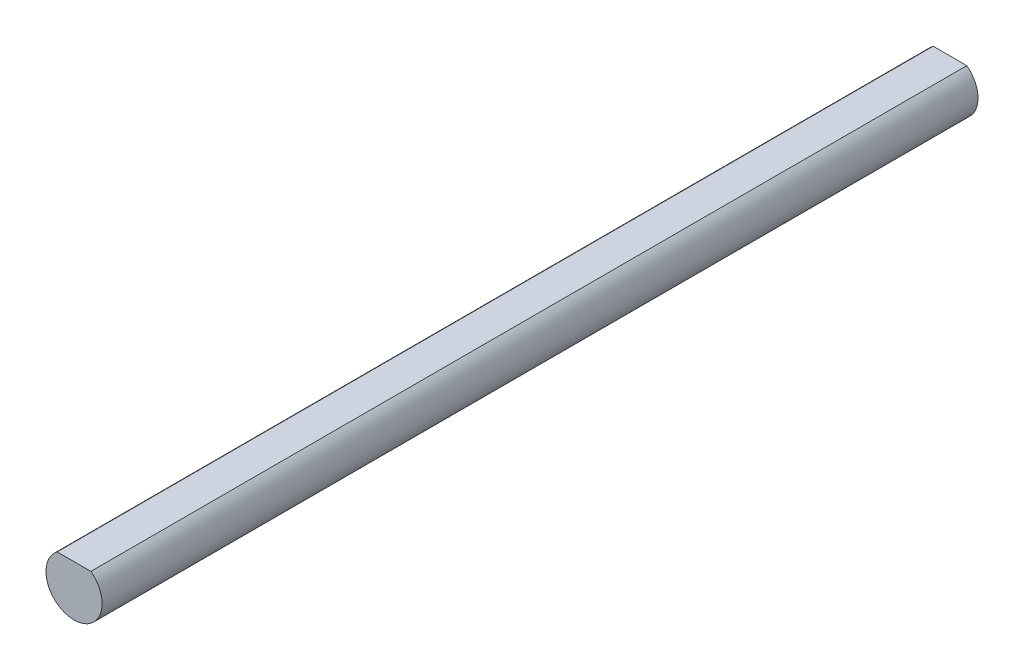
ISO-10303-21;
HEADER;
FILE_DESCRIPTION(('STEP AP214'),'2;1');
FILE_NAME('part.step','',(''),(''),'','','');
FILE_SCHEMA(('AUTOMOTIVE_DESIGN { 1 0 10303 214 1 1 1 1 }'));
ENDSEC;
DATA;
#1=APPLICATION_CONTEXT('core data for automotive mechanical design processes');
#2=APPLICATION_PROTOCOL_DEFINITION('international standard','automotive_design',2000,#1);
#3=PRODUCT_CONTEXT('',#1,'mechanical');
#4=PRODUCT('Part','Part','',(#3));
#5=PRODUCT_RELATED_PRODUCT_CATEGORY('part','',(#4));
#6=PRODUCT_DEFINITION_FORMATION('','',#4);
#7=PRODUCT_DEFINITION_CONTEXT('part definition',#1,'design');
#8=PRODUCT_DEFINITION('design','',#6,#7);
#9=PRODUCT_DEFINITION_SHAPE('','',#8);
#10=(LENGTH_UNIT() NAMED_UNIT(*) SI_UNIT(.MILLI.,.METRE.));
#11=(NAMED_UNIT(*) PLANE_ANGLE_UNIT() SI_UNIT($,.RADIAN.));
#12=(NAMED_UNIT(*) SI_UNIT($,.STERADIAN.) SOLID_ANGLE_UNIT());
#13=UNCERTAINTY_MEASURE_WITH_UNIT(LENGTH_MEASURE(1.E-05),#10,'distance_accuracy_value','');
#14=(GEOMETRIC_REPRESENTATION_CONTEXT(3) GLOBAL_UNCERTAINTY_ASSIGNED_CONTEXT((#13)) GLOBAL_UNIT_ASSIGNED_CONTEXT((#10,
#11,#12)) REPRESENTATION_CONTEXT('',''));
#15=CARTESIAN_POINT('',(0.,0.,0.));
#16=DIRECTION('',(0.,0.,1.));
#17=DIRECTION('',(1.,0.,0.));
#18=AXIS2_PLACEMENT_3D('',#15,#16,#17);
#19=CARTESIAN_POINT('',(0.,0.,-78.));
#20=DIRECTION('',(0.,0.,1.));
#21=DIRECTION('',(1.,0.,0.));
#22=AXIS2_PLACEMENT_3D('',#19,#20,#21);
#23=CYLINDRICAL_SURFACE('',#22,5.);
#24=DIRECTION('',(0.,0.,1.));
#25=VECTOR('',#24,1.);
#26=CARTESIAN_POINT('',(3.,4.,-78.));
#27=LINE('',#26,#25);
#28=CARTESIAN_POINT('',(3.,4.,-78.));
#29=VERTEX_POINT('',#28);
#30=CARTESIAN_POINT('',(3.,4.,78.));
#31=VERTEX_POINT('',#30);
#32=EDGE_CURVE('E57',#29,#31,#27,.T.);
#33=ORIENTED_EDGE('',*,*,#32,.T.);
#34=CARTESIAN_POINT('',(0.,0.,78.));
#35=DIRECTION('',(0.,0.,1.));
#36=DIRECTION('',(1.,0.,0.));
#37=AXIS2_PLACEMENT_3D('',#34,#35,#36);
#38=CIRCLE('',#37,5.);
#39=CARTESIAN_POINT('',(-3.,4.,78.));
#40=VERTEX_POINT('',#39);
#41=EDGE_CURVE('E44',#40,#31,#38,.T.);
#42=ORIENTED_EDGE('',*,*,#41,.F.);
#43=DIRECTION('',(0.,0.,1.));
#44=VECTOR('',#43,1.);
#45=CARTESIAN_POINT('',(-3.,4.,-78.));
#46=LINE('',#45,#44);
#47=CARTESIAN_POINT('',(-3.,4.,-78.));
#48=VERTEX_POINT('',#47);
#49=EDGE_CURVE('E51',#48,#40,#46,.T.);
#50=ORIENTED_EDGE('',*,*,#49,.F.);
#51=CARTESIAN_POINT('',(0.,0.,-78.));
#52=DIRECTION('',(0.,0.,1.));
#53=DIRECTION('',(1.,0.,0.));
#54=AXIS2_PLACEMENT_3D('',#51,#52,#53);
#55=CIRCLE('',#54,5.);
#56=EDGE_CURVE('E11',#48,#29,#55,.T.);
#57=ORIENTED_EDGE('',*,*,#56,.T.);
#58=EDGE_LOOP('',(#33,#42,#50,#57));
#59=FACE_BOUND('',#58,.T.);
#60=ADVANCED_FACE('F37',(#59),#23,.T.);
#61=CARTESIAN_POINT('',(0.,0.,-78.));
#62=DIRECTION('',(0.,0.,1.));
#63=DIRECTION('',(1.,0.,0.));
#64=AXIS2_PLACEMENT_3D('',#61,#62,#63);
#65=PLANE('',#64);
#66=ORIENTED_EDGE('',*,*,#56,.F.);
#67=DIRECTION('',(1.,0.,0.));
#68=VECTOR('',#67,1.);
#69=CARTESIAN_POINT('',(-3.,4.,-78.));
#70=LINE('',#69,#68);
#71=EDGE_CURVE('E66',#48,#29,#70,.T.);
#72=ORIENTED_EDGE('',*,*,#71,.T.);
#73=EDGE_LOOP('',(#66,#72));
#74=FACE_BOUND('',#73,.T.);
#75=ADVANCED_FACE('F75',(#74),#65,.F.);
#76=CARTESIAN_POINT('',(0.,0.,78.));
#77=DIRECTION('',(0.,0.,1.));
#78=DIRECTION('',(1.,0.,0.));
#79=AXIS2_PLACEMENT_3D('',#76,#77,#78);
#80=PLANE('',#79);
#81=DIRECTION('',(1.,0.,0.));
#82=VECTOR('',#81,1.);
#83=CARTESIAN_POINT('',(-3.,4.,78.));
#84=LINE('',#83,#82);
#85=EDGE_CURVE('E61',#40,#31,#84,.T.);
#86=ORIENTED_EDGE('',*,*,#85,.F.);
#87=ORIENTED_EDGE('',*,*,#41,.T.);
#88=EDGE_LOOP('',(#86,#87));
#89=FACE_BOUND('',#88,.T.);
#90=ADVANCED_FACE('F71',(#89),#80,.T.);
#91=CARTESIAN_POINT('',(-3.,4.,-78.));
#92=DIRECTION('',(0.,-1.,0.));
#93=DIRECTION('',(0.,0.,-1.));
#94=AXIS2_PLACEMENT_3D('',#91,#92,#93);
#95=PLANE('',#94);
#96=ORIENTED_EDGE('',*,*,#85,.T.);
#97=ORIENTED_EDGE('',*,*,#32,.F.);
#98=ORIENTED_EDGE('',*,*,#71,.F.);
#99=ORIENTED_EDGE('',*,*,#49,.T.);
#100=EDGE_LOOP('',(#96,#97,#98,#99));
#101=FACE_BOUND('',#100,.T.);
#102=ADVANCED_FACE('F62',(#101),#95,.F.);
#103=CLOSED_SHELL('',(#60,#75,#90,#102));
#104=MANIFOLD_SOLID_BREP('B2',#103);
#105=ADVANCED_BREP_SHAPE_REPRESENTATION('',(#18,#104),#14);
#106=SHAPE_DEFINITION_REPRESENTATION(#9,#105);
ENDSEC;
END-ISO-10303-21;
